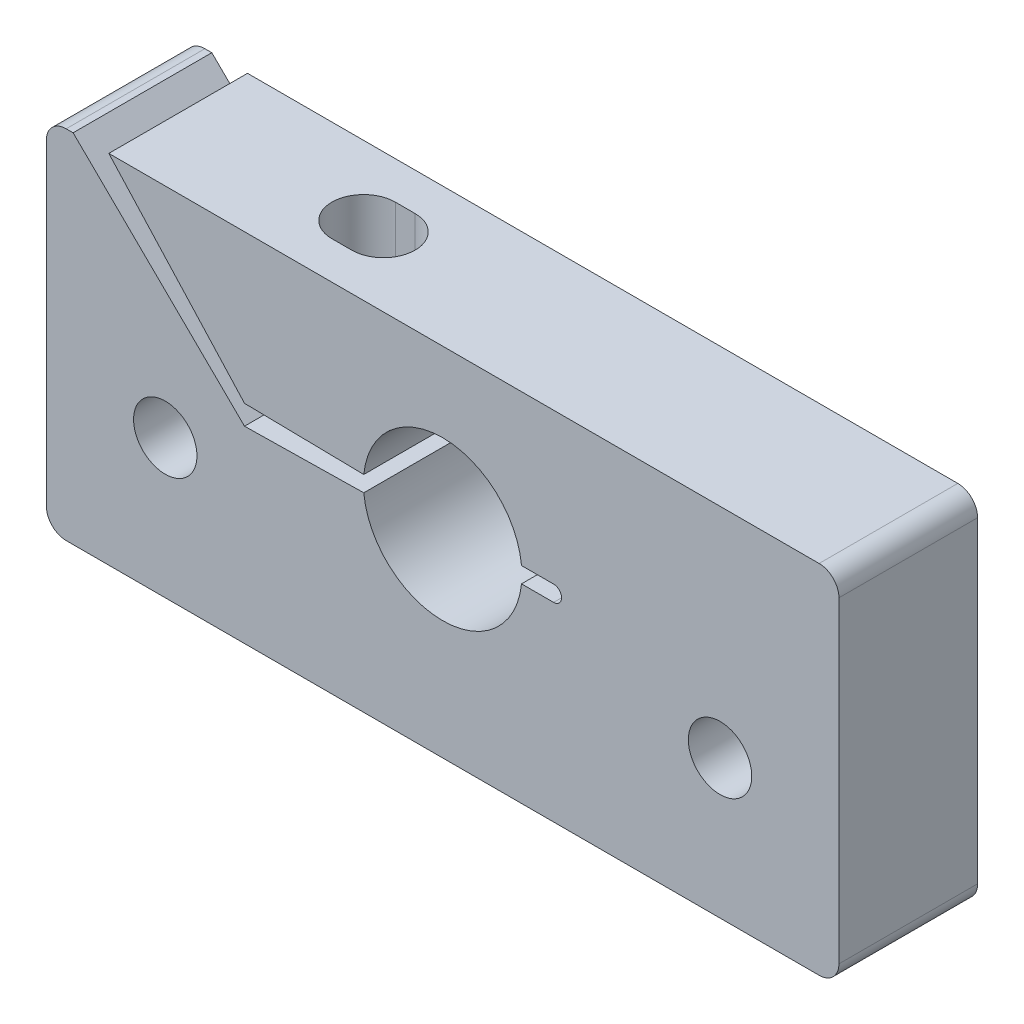
ISO-10303-21;
HEADER;
FILE_DESCRIPTION(('STEP AP214'),'2;1');
FILE_NAME('part.step','',(''),(''),'','','');
FILE_SCHEMA(('AUTOMOTIVE_DESIGN { 1 0 10303 214 1 1 1 1 }'));
ENDSEC;
DATA;
#1=APPLICATION_CONTEXT('core data for automotive mechanical design processes');
#2=APPLICATION_PROTOCOL_DEFINITION('international standard','automotive_design',2000,#1);
#3=PRODUCT_CONTEXT('',#1,'mechanical');
#4=PRODUCT('Part','Part','',(#3));
#5=PRODUCT_RELATED_PRODUCT_CATEGORY('part','',(#4));
#6=PRODUCT_DEFINITION_FORMATION('','',#4);
#7=PRODUCT_DEFINITION_CONTEXT('part definition',#1,'design');
#8=PRODUCT_DEFINITION('design','',#6,#7);
#9=PRODUCT_DEFINITION_SHAPE('','',#8);
#10=(LENGTH_UNIT() NAMED_UNIT(*) SI_UNIT(.MILLI.,.METRE.));
#11=(NAMED_UNIT(*) PLANE_ANGLE_UNIT() SI_UNIT($,.RADIAN.));
#12=(NAMED_UNIT(*) SI_UNIT($,.STERADIAN.) SOLID_ANGLE_UNIT());
#13=UNCERTAINTY_MEASURE_WITH_UNIT(LENGTH_MEASURE(1.E-05),#10,'distance_accuracy_value','');
#14=(GEOMETRIC_REPRESENTATION_CONTEXT(3) GLOBAL_UNCERTAINTY_ASSIGNED_CONTEXT((#13)) GLOBAL_UNIT_ASSIGNED_CONTEXT((#10,
#11,#12)) REPRESENTATION_CONTEXT('',''));
#15=CARTESIAN_POINT('',(0.,0.,0.));
#16=DIRECTION('',(0.,0.,1.));
#17=DIRECTION('',(1.,0.,0.));
#18=AXIS2_PLACEMENT_3D('',#15,#16,#17);
#19=CARTESIAN_POINT('',(5.6,0.,-3.5));
#20=DIRECTION('',(0.,0.,1.));
#21=DIRECTION('',(1.,0.,0.));
#22=AXIS2_PLACEMENT_3D('',#19,#20,#21);
#23=CYLINDRICAL_SURFACE('',#22,0.4);
#24=DIRECTION('',(0.,0.,-1.));
#25=VECTOR('',#24,1.);
#26=CARTESIAN_POINT('',(5.6,0.4,-3.5));
#27=LINE('',#26,#25);
#28=CARTESIAN_POINT('',(5.6,0.4,-3.5));
#29=VERTEX_POINT('',#28);
#30=CARTESIAN_POINT('',(5.6,0.4,3.5));
#31=VERTEX_POINT('',#30);
#32=EDGE_CURVE('E460',#29,#31,#27,.F.);
#33=ORIENTED_EDGE('',*,*,#32,.F.);
#34=CARTESIAN_POINT('',(5.6,0.,-3.5));
#35=DIRECTION('',(0.,0.,1.));
#36=DIRECTION('',(1.,0.,0.));
#37=AXIS2_PLACEMENT_3D('',#34,#35,#36);
#38=CIRCLE('',#37,0.4);
#39=CARTESIAN_POINT('',(5.6,-0.4,-3.5));
#40=VERTEX_POINT('',#39);
#41=EDGE_CURVE('E59',#29,#40,#38,.F.);
#42=ORIENTED_EDGE('',*,*,#41,.T.);
#43=DIRECTION('',(0.,0.,-1.));
#44=VECTOR('',#43,1.);
#45=CARTESIAN_POINT('',(5.6,-0.4,-3.5));
#46=LINE('',#45,#44);
#47=CARTESIAN_POINT('',(5.6,-0.4,3.5));
#48=VERTEX_POINT('',#47);
#49=EDGE_CURVE('E461',#48,#40,#46,.T.);
#50=ORIENTED_EDGE('',*,*,#49,.F.);
#51=CARTESIAN_POINT('',(5.6,0.,3.5));
#52=DIRECTION('',(0.,0.,1.));
#53=DIRECTION('',(1.,0.,0.));
#54=AXIS2_PLACEMENT_3D('',#51,#52,#53);
#55=CIRCLE('',#54,0.4);
#56=EDGE_CURVE('E11',#48,#31,#55,.T.);
#57=ORIENTED_EDGE('',*,*,#56,.T.);
#58=EDGE_LOOP('',(#33,#42,#50,#57));
#59=FACE_BOUND('',#58,.T.);
#60=ADVANCED_FACE('F47',(#59),#23,.F.);
#61=CARTESIAN_POINT('',(-6.98997487421324,8.001,0.));
#62=DIRECTION('',(0.,-1.,0.));
#63=DIRECTION('',(0.,0.,-1.));
#64=AXIS2_PLACEMENT_3D('',#61,#62,#63);
#65=CYLINDRICAL_SURFACE('',#64,1.6);
#66=CARTESIAN_POINT('',(-6.98997487421324,-0.450000000000001,0.));
#67=DIRECTION('',(-0.0166088657318921,0.99986206327628,0.));
#68=DIRECTION('',(-0.99986206327628,-0.0166088657318921,0.));
#69=AXIS2_PLACEMENT_3D('',#66,#67,#68);
#70=ELLIPSE('',#69,1.60022072920462,1.6);
#71=CARTESIAN_POINT('',(-8.58997487421324,-0.476577851232751,0.));
#72=VERTEX_POINT('',#71);
#73=EDGE_CURVE('E260',#72,#72,#70,.F.);
#74=ORIENTED_EDGE('',*,*,#73,.F.);
#75=EDGE_LOOP('',(#74));
#76=FACE_BOUND('',#75,.T.);
#77=CARTESIAN_POINT('',(-6.98997487421324,-4.,0.));
#78=DIRECTION('',(0.,-1.,0.));
#79=DIRECTION('',(0.,0.,-1.));
#80=AXIS2_PLACEMENT_3D('',#77,#78,#79);
#81=CIRCLE('',#80,1.6);
#82=CARTESIAN_POINT('',(-6.98997487421324,-4.,-1.6));
#83=VERTEX_POINT('',#82);
#84=EDGE_CURVE('E216',#83,#83,#81,.T.);
#85=ORIENTED_EDGE('',*,*,#84,.T.);
#86=EDGE_LOOP('',(#85));
#87=FACE_BOUND('',#86,.T.);
#88=ADVANCED_FACE('F488',(#76,#87),#65,.F.);
#89=CARTESIAN_POINT('',(0.,0.,-3.5));
#90=DIRECTION('',(0.,0.,1.));
#91=DIRECTION('',(1.,0.,0.));
#92=AXIS2_PLACEMENT_3D('',#89,#90,#91);
#93=CYLINDRICAL_SURFACE('',#92,4.);
#94=DIRECTION('',(0.,0.,1.));
#95=VECTOR('',#94,1.);
#96=CARTESIAN_POINT('',(3.97994974842648,0.4,-3.5));
#97=LINE('',#96,#95);
#98=CARTESIAN_POINT('',(3.97994974842648,0.4,-3.5));
#99=VERTEX_POINT('',#98);
#100=CARTESIAN_POINT('',(3.97994974842648,0.4,3.5));
#101=VERTEX_POINT('',#100);
#102=EDGE_CURVE('E378',#99,#101,#97,.T.);
#103=ORIENTED_EDGE('',*,*,#102,.T.);
#104=CARTESIAN_POINT('',(0.,0.,3.5));
#105=DIRECTION('',(0.,0.,-1.));
#106=DIRECTION('',(1.,0.,0.));
#107=AXIS2_PLACEMENT_3D('',#104,#105,#106);
#108=CIRCLE('',#107,4.);
#109=CARTESIAN_POINT('',(-3.97994974842648,0.4,3.5));
#110=VERTEX_POINT('',#109);
#111=EDGE_CURVE('E275',#110,#101,#108,.T.);
#112=ORIENTED_EDGE('',*,*,#111,.F.);
#113=DIRECTION('',(0.,0.,1.));
#114=VECTOR('',#113,1.);
#115=CARTESIAN_POINT('',(-3.97994974842648,0.4,-3.5));
#116=LINE('',#115,#114);
#117=CARTESIAN_POINT('',(-3.97994974842648,0.4,-3.5));
#118=VERTEX_POINT('',#117);
#119=EDGE_CURVE('E379',#118,#110,#116,.T.);
#120=ORIENTED_EDGE('',*,*,#119,.F.);
#121=CARTESIAN_POINT('',(0.,0.,-3.5));
#122=DIRECTION('',(0.,0.,-1.));
#123=DIRECTION('',(1.,0.,0.));
#124=AXIS2_PLACEMENT_3D('',#121,#122,#123);
#125=CIRCLE('',#124,4.);
#126=EDGE_CURVE('E326',#118,#99,#125,.T.);
#127=ORIENTED_EDGE('',*,*,#126,.T.);
#128=EDGE_LOOP('',(#103,#112,#120,#127));
#129=FACE_BOUND('',#128,.T.);
#130=ADVANCED_FACE('F495',(#129),#93,.F.);
#131=CARTESIAN_POINT('',(-10.,0.5,-3.5));
#132=DIRECTION('',(-0.0166088657318921,-0.99986206327628,0.));
#133=DIRECTION('',(0.99986206327628,-0.0166088657318921,0.));
#134=AXIS2_PLACEMENT_3D('',#131,#132,#133);
#135=PLANE('',#134);
#136=CARTESIAN_POINT('',(-7.48997487421324,0.458305578510235,0.));
#137=DIRECTION('',(-0.0166088657318921,-0.99986206327628,0.));
#138=DIRECTION('',(-0.99986206327628,0.0166088657318921,0.));
#139=AXIS2_PLACEMENT_3D('',#136,#137,#138);
#140=ELLIPSE('',#139,1.60022072920462,1.6);
#141=CARTESIAN_POINT('',(-7.48997487421324,0.458305578510236,-1.6));
#142=VERTEX_POINT('',#141);
#143=CARTESIAN_POINT('',(-7.48997487421324,0.458305578510236,1.6));
#144=VERTEX_POINT('',#143);
#145=EDGE_CURVE('E204',#142,#144,#140,.F.);
#146=ORIENTED_EDGE('',*,*,#145,.T.);
#147=DIRECTION('',(0.99986206327628,-0.0166088657318921,0.));
#148=VECTOR('',#147,1.);
#149=CARTESIAN_POINT('',(-7.31628163419263,0.45542033282686,1.6));
#150=LINE('',#149,#148);
#151=CARTESIAN_POINT('',(-6.48997487421324,0.441694421489766,1.6));
#152=VERTEX_POINT('',#151);
#153=EDGE_CURVE('E231',#144,#152,#150,.T.);
#154=ORIENTED_EDGE('',*,*,#153,.T.);
#155=CARTESIAN_POINT('',(-6.48997487421324,0.441694421489766,0.));
#156=DIRECTION('',(-0.0166088657318921,-0.99986206327628,0.));
#157=DIRECTION('',(-0.99986206327628,0.0166088657318921,0.));
#158=AXIS2_PLACEMENT_3D('',#155,#156,#157);
#159=ELLIPSE('',#158,1.60022072920462,1.6);
#160=CARTESIAN_POINT('',(-6.48997487421324,0.441694421489766,-1.6));
#161=VERTEX_POINT('',#160);
#162=EDGE_CURVE('E210',#152,#161,#159,.F.);
#163=ORIENTED_EDGE('',*,*,#162,.T.);
#164=DIRECTION('',(-0.99986206327628,0.0166088657318921,0.));
#165=VECTOR('',#164,1.);
#166=CARTESIAN_POINT('',(-7.31628163419263,0.45542033282686,-1.6));
#167=LINE('',#166,#165);
#168=EDGE_CURVE('E206',#161,#142,#167,.T.);
#169=ORIENTED_EDGE('',*,*,#168,.T.);
#170=EDGE_LOOP('',(#146,#154,#163,#169));
#171=FACE_BOUND('',#170,.T.);
#172=ORIENTED_EDGE('',*,*,#119,.T.);
#173=DIRECTION('',(0.99986206327628,-0.0166088657318921,0.));
#174=VECTOR('',#173,1.);
#175=CARTESIAN_POINT('',(-10.,0.5,3.5));
#176=LINE('',#175,#174);
#177=CARTESIAN_POINT('',(-10.,0.5,3.5));
#178=VERTEX_POINT('',#177);
#179=EDGE_CURVE('E320',#178,#110,#176,.T.);
#180=ORIENTED_EDGE('',*,*,#179,.F.);
#181=DIRECTION('',(0.,0.,1.));
#182=VECTOR('',#181,1.);
#183=CARTESIAN_POINT('',(-10.,0.5,-3.5));
#184=LINE('',#183,#182);
#185=CARTESIAN_POINT('',(-10.,0.5,-3.5));
#186=VERTEX_POINT('',#185);
#187=EDGE_CURVE('E381',#186,#178,#184,.T.);
#188=ORIENTED_EDGE('',*,*,#187,.F.);
#189=DIRECTION('',(0.99986206327628,-0.0166088657318921,0.));
#190=VECTOR('',#189,1.);
#191=CARTESIAN_POINT('',(-10.,0.5,-3.5));
#192=LINE('',#191,#190);
#193=EDGE_CURVE('E374',#186,#118,#192,.T.);
#194=ORIENTED_EDGE('',*,*,#193,.T.);
#195=EDGE_LOOP('',(#172,#180,#188,#194));
#196=FACE_BOUND('',#195,.T.);
#197=ADVANCED_FACE('F468',(#171,#196),#135,.T.);
#198=CARTESIAN_POINT('',(-10.,0.5,-3.5));
#199=DIRECTION('',(-0.73845534062588,-0.674302387583728,0.));
#200=DIRECTION('',(0.674302387583728,-0.73845534062588,0.));
#201=AXIS2_PLACEMENT_3D('',#198,#199,#200);
#202=PLANE('',#201);
#203=ORIENTED_EDGE('',*,*,#187,.T.);
#204=DIRECTION('',(0.674302387583728,-0.73845534062588,0.));
#205=VECTOR('',#204,1.);
#206=CARTESIAN_POINT('',(-10.,0.5,3.5));
#207=LINE('',#206,#205);
#208=CARTESIAN_POINT('',(-16.8484411021954,8.,3.5));
#209=VERTEX_POINT('',#208);
#210=EDGE_CURVE('E312',#209,#178,#207,.T.);
#211=ORIENTED_EDGE('',*,*,#210,.F.);
#212=DIRECTION('',(0.,0.,1.));
#213=VECTOR('',#212,1.);
#214=CARTESIAN_POINT('',(-16.8484411021954,8.,-3.5));
#215=LINE('',#214,#213);
#216=CARTESIAN_POINT('',(-16.8484411021954,8.,-3.5));
#217=VERTEX_POINT('',#216);
#218=EDGE_CURVE('E390',#217,#209,#215,.T.);
#219=ORIENTED_EDGE('',*,*,#218,.F.);
#220=DIRECTION('',(0.674302387583728,-0.73845534062588,0.));
#221=VECTOR('',#220,1.);
#222=CARTESIAN_POINT('',(-10.,0.5,-3.5));
#223=LINE('',#222,#221);
#224=EDGE_CURVE('E371',#217,#186,#223,.T.);
#225=ORIENTED_EDGE('',*,*,#224,.T.);
#226=EDGE_LOOP('',(#203,#211,#219,#225));
#227=FACE_BOUND('',#226,.T.);
#228=ADVANCED_FACE('F511',(#227),#202,.T.);
#229=CARTESIAN_POINT('',(-16.8484411021954,8.,-3.5));
#230=DIRECTION('',(0.,1.,0.));
#231=DIRECTION('',(-1.,0.,0.));
#232=AXIS2_PLACEMENT_3D('',#229,#230,#231);
#233=PLANE('',#232);
#234=CARTESIAN_POINT('',(-7.48997487421324,8.,0.));
#235=DIRECTION('',(0.,1.,0.));
#236=DIRECTION('',(0.,0.,1.));
#237=AXIS2_PLACEMENT_3D('',#234,#235,#236);
#238=CIRCLE('',#237,1.6);
#239=CARTESIAN_POINT('',(-7.48997487421324,8.,-1.6));
#240=VERTEX_POINT('',#239);
#241=CARTESIAN_POINT('',(-7.48997487421324,8.,1.6));
#242=VERTEX_POINT('',#241);
#243=EDGE_CURVE('E198',#240,#242,#238,.T.);
#244=ORIENTED_EDGE('',*,*,#243,.F.);
#245=DIRECTION('',(-1.,0.,0.));
#246=VECTOR('',#245,1.);
#247=CARTESIAN_POINT('',(-7.48997487421324,8.,-1.6));
#248=LINE('',#247,#246);
#249=CARTESIAN_POINT('',(-6.48997487421324,8.,-1.6));
#250=VERTEX_POINT('',#249);
#251=EDGE_CURVE('E211',#250,#240,#248,.T.);
#252=ORIENTED_EDGE('',*,*,#251,.F.);
#253=CARTESIAN_POINT('',(-6.48997487421324,8.,0.));
#254=DIRECTION('',(0.,1.,0.));
#255=DIRECTION('',(0.,0.,1.));
#256=AXIS2_PLACEMENT_3D('',#253,#254,#255);
#257=CIRCLE('',#256,1.6);
#258=CARTESIAN_POINT('',(-6.48997487421324,8.,1.6));
#259=VERTEX_POINT('',#258);
#260=EDGE_CURVE('E218',#259,#250,#257,.T.);
#261=ORIENTED_EDGE('',*,*,#260,.F.);
#262=DIRECTION('',(1.,0.,0.));
#263=VECTOR('',#262,1.);
#264=CARTESIAN_POINT('',(-7.48997487421324,8.,1.6));
#265=LINE('',#264,#263);
#266=EDGE_CURVE('E228',#242,#259,#265,.T.);
#267=ORIENTED_EDGE('',*,*,#266,.F.);
#268=EDGE_LOOP('',(#244,#252,#261,#267));
#269=FACE_BOUND('',#268,.T.);
#270=DIRECTION('',(-1.,0.,0.));
#271=VECTOR('',#270,1.);
#272=CARTESIAN_POINT('',(-16.8484411021954,8.,3.5));
#273=LINE('',#272,#271);
#274=CARTESIAN_POINT('',(19.,8.,3.5));
#275=VERTEX_POINT('',#274);
#276=EDGE_CURVE('E309',#275,#209,#273,.T.);
#277=ORIENTED_EDGE('',*,*,#276,.F.);
#278=DIRECTION('',(0.,0.,1.));
#279=VECTOR('',#278,1.);
#280=CARTESIAN_POINT('',(19.,8.,-3.5));
#281=LINE('',#280,#279);
#282=CARTESIAN_POINT('',(19.,8.,-3.5));
#283=VERTEX_POINT('',#282);
#284=EDGE_CURVE('E448',#275,#283,#281,.F.);
#285=ORIENTED_EDGE('',*,*,#284,.T.);
#286=DIRECTION('',(-1.,0.,0.));
#287=VECTOR('',#286,1.);
#288=CARTESIAN_POINT('',(-16.8484411021954,8.,-3.5));
#289=LINE('',#288,#287);
#290=EDGE_CURVE('E368',#283,#217,#289,.T.);
#291=ORIENTED_EDGE('',*,*,#290,.T.);
#292=ORIENTED_EDGE('',*,*,#218,.T.);
#293=EDGE_LOOP('',(#277,#285,#291,#292));
#294=FACE_BOUND('',#293,.T.);
#295=ADVANCED_FACE('F224',(#269,#294),#233,.T.);
#296=CARTESIAN_POINT('',(20.,8.,-3.5));
#297=DIRECTION('',(1.,0.,0.));
#298=DIRECTION('',(0.,1.,0.));
#299=AXIS2_PLACEMENT_3D('',#296,#297,#298);
#300=PLANE('',#299);
#301=DIRECTION('',(0.,1.,0.));
#302=VECTOR('',#301,1.);
#303=CARTESIAN_POINT('',(20.,8.,3.5));
#304=LINE('',#303,#302);
#305=CARTESIAN_POINT('',(20.,-9.,3.5));
#306=VERTEX_POINT('',#305);
#307=CARTESIAN_POINT('',(20.,7.,3.5));
#308=VERTEX_POINT('',#307);
#309=EDGE_CURVE('E306',#306,#308,#304,.T.);
#310=ORIENTED_EDGE('',*,*,#309,.F.);
#311=DIRECTION('',(0.,0.,1.));
#312=VECTOR('',#311,1.);
#313=CARTESIAN_POINT('',(20.,-9.,-3.5));
#314=LINE('',#313,#312);
#315=CARTESIAN_POINT('',(20.,-9.,-3.5));
#316=VERTEX_POINT('',#315);
#317=EDGE_CURVE('E450',#306,#316,#314,.F.);
#318=ORIENTED_EDGE('',*,*,#317,.T.);
#319=DIRECTION('',(0.,1.,0.));
#320=VECTOR('',#319,1.);
#321=CARTESIAN_POINT('',(20.,8.,-3.5));
#322=LINE('',#321,#320);
#323=CARTESIAN_POINT('',(20.,7.,-3.5));
#324=VERTEX_POINT('',#323);
#325=EDGE_CURVE('E364',#316,#324,#322,.T.);
#326=ORIENTED_EDGE('',*,*,#325,.T.);
#327=DIRECTION('',(0.,0.,1.));
#328=VECTOR('',#327,1.);
#329=CARTESIAN_POINT('',(20.,7.,-3.5));
#330=LINE('',#329,#328);
#331=EDGE_CURVE('E442',#324,#308,#330,.T.);
#332=ORIENTED_EDGE('',*,*,#331,.T.);
#333=EDGE_LOOP('',(#310,#318,#326,#332));
#334=FACE_BOUND('',#333,.T.);
#335=ADVANCED_FACE('F523',(#334),#300,.T.);
#336=CARTESIAN_POINT('',(-20.,-10.,-3.5));
#337=DIRECTION('',(0.,-1.,0.));
#338=DIRECTION('',(0.,0.,-1.));
#339=AXIS2_PLACEMENT_3D('',#336,#337,#338);
#340=PLANE('',#339);
#341=CARTESIAN_POINT('',(-6.98997487421324,-10.,0.));
#342=DIRECTION('',(0.,-1.,0.));
#343=DIRECTION('',(0.,0.,-1.));
#344=AXIS2_PLACEMENT_3D('',#341,#342,#343);
#345=CIRCLE('',#344,2.2);
#346=CARTESIAN_POINT('',(-6.98997487421324,-10.,-2.2));
#347=VERTEX_POINT('',#346);
#348=EDGE_CURVE('E255',#347,#347,#345,.T.);
#349=ORIENTED_EDGE('',*,*,#348,.F.);
#350=EDGE_LOOP('',(#349));
#351=FACE_BOUND('',#350,.T.);
#352=DIRECTION('',(1.,0.,0.));
#353=VECTOR('',#352,1.);
#354=CARTESIAN_POINT('',(-20.,-10.,3.5));
#355=LINE('',#354,#353);
#356=CARTESIAN_POINT('',(-19.,-10.,3.5));
#357=VERTEX_POINT('',#356);
#358=CARTESIAN_POINT('',(19.,-10.,3.5));
#359=VERTEX_POINT('',#358);
#360=EDGE_CURVE('E305',#357,#359,#355,.T.);
#361=ORIENTED_EDGE('',*,*,#360,.F.);
#362=DIRECTION('',(0.,0.,1.));
#363=VECTOR('',#362,1.);
#364=CARTESIAN_POINT('',(-19.,-10.,-3.5));
#365=LINE('',#364,#363);
#366=CARTESIAN_POINT('',(-19.,-10.,-3.5));
#367=VERTEX_POINT('',#366);
#368=EDGE_CURVE('E426',#357,#367,#365,.F.);
#369=ORIENTED_EDGE('',*,*,#368,.T.);
#370=DIRECTION('',(1.,0.,0.));
#371=VECTOR('',#370,1.);
#372=CARTESIAN_POINT('',(-20.,-10.,-3.5));
#373=LINE('',#372,#371);
#374=CARTESIAN_POINT('',(19.,-10.,-3.5));
#375=VERTEX_POINT('',#374);
#376=EDGE_CURVE('E359',#367,#375,#373,.T.);
#377=ORIENTED_EDGE('',*,*,#376,.T.);
#378=DIRECTION('',(0.,0.,1.));
#379=VECTOR('',#378,1.);
#380=CARTESIAN_POINT('',(19.,-10.,-3.5));
#381=LINE('',#380,#379);
#382=EDGE_CURVE('E425',#375,#359,#381,.T.);
#383=ORIENTED_EDGE('',*,*,#382,.T.);
#384=EDGE_LOOP('',(#361,#369,#377,#383));
#385=FACE_BOUND('',#384,.T.);
#386=ADVANCED_FACE('F531',(#351,#385),#340,.T.);
#387=CARTESIAN_POINT('',(-20.,8.,-3.5));
#388=DIRECTION('',(-1.,0.,0.));
#389=DIRECTION('',(0.,-1.,0.));
#390=AXIS2_PLACEMENT_3D('',#387,#388,#389);
#391=PLANE('',#390);
#392=DIRECTION('',(0.,-1.,0.));
#393=VECTOR('',#392,1.);
#394=CARTESIAN_POINT('',(-20.,8.,-3.5));
#395=LINE('',#394,#393);
#396=CARTESIAN_POINT('',(-20.,7.,-3.5));
#397=VERTEX_POINT('',#396);
#398=CARTESIAN_POINT('',(-20.,-9.,-3.5));
#399=VERTEX_POINT('',#398);
#400=EDGE_CURVE('E358',#397,#399,#395,.T.);
#401=ORIENTED_EDGE('',*,*,#400,.T.);
#402=DIRECTION('',(0.,0.,1.));
#403=VECTOR('',#402,1.);
#404=CARTESIAN_POINT('',(-20.,-9.,-3.5));
#405=LINE('',#404,#403);
#406=CARTESIAN_POINT('',(-20.,-9.,3.5));
#407=VERTEX_POINT('',#406);
#408=EDGE_CURVE('E407',#399,#407,#405,.T.);
#409=ORIENTED_EDGE('',*,*,#408,.T.);
#410=DIRECTION('',(0.,-1.,0.));
#411=VECTOR('',#410,1.);
#412=CARTESIAN_POINT('',(-20.,8.,3.5));
#413=LINE('',#412,#411);
#414=CARTESIAN_POINT('',(-20.,7.,3.5));
#415=VERTEX_POINT('',#414);
#416=EDGE_CURVE('E296',#415,#407,#413,.T.);
#417=ORIENTED_EDGE('',*,*,#416,.F.);
#418=DIRECTION('',(0.,0.,1.));
#419=VECTOR('',#418,1.);
#420=CARTESIAN_POINT('',(-20.,7.,-3.5));
#421=LINE('',#420,#419);
#422=EDGE_CURVE('E384',#415,#397,#421,.F.);
#423=ORIENTED_EDGE('',*,*,#422,.T.);
#424=EDGE_LOOP('',(#401,#409,#417,#423));
#425=FACE_BOUND('',#424,.T.);
#426=ADVANCED_FACE('F542',(#425),#391,.T.);
#427=CARTESIAN_POINT('',(-20.,8.,-3.5));
#428=DIRECTION('',(0.,1.,0.));
#429=DIRECTION('',(0.,0.,1.));
#430=AXIS2_PLACEMENT_3D('',#427,#428,#429);
#431=PLANE('',#430);
#432=DIRECTION('',(-1.,0.,0.));
#433=VECTOR('',#432,1.);
#434=CARTESIAN_POINT('',(-20.,8.,-3.5));
#435=LINE('',#434,#433);
#436=CARTESIAN_POINT('',(-18.6496628402632,8.,-3.5));
#437=VERTEX_POINT('',#436);
#438=CARTESIAN_POINT('',(-19.,8.,-3.5));
#439=VERTEX_POINT('',#438);
#440=EDGE_CURVE('E352',#437,#439,#435,.T.);
#441=ORIENTED_EDGE('',*,*,#440,.T.);
#442=DIRECTION('',(0.,0.,1.));
#443=VECTOR('',#442,1.);
#444=CARTESIAN_POINT('',(-19.,8.,-3.5));
#445=LINE('',#444,#443);
#446=CARTESIAN_POINT('',(-19.,8.,3.5));
#447=VERTEX_POINT('',#446);
#448=EDGE_CURVE('E452',#439,#447,#445,.T.);
#449=ORIENTED_EDGE('',*,*,#448,.T.);
#450=DIRECTION('',(-1.,0.,0.));
#451=VECTOR('',#450,1.);
#452=CARTESIAN_POINT('',(-20.,8.,3.5));
#453=LINE('',#452,#451);
#454=CARTESIAN_POINT('',(-18.6496628402632,8.,3.5));
#455=VERTEX_POINT('',#454);
#456=EDGE_CURVE('E295',#455,#447,#453,.T.);
#457=ORIENTED_EDGE('',*,*,#456,.F.);
#458=DIRECTION('',(0.,0.,1.));
#459=VECTOR('',#458,1.);
#460=CARTESIAN_POINT('',(-18.6496628402632,8.,-3.5));
#461=LINE('',#460,#459);
#462=EDGE_CURVE('E392',#437,#455,#461,.T.);
#463=ORIENTED_EDGE('',*,*,#462,.F.);
#464=EDGE_LOOP('',(#441,#449,#457,#463));
#465=FACE_BOUND('',#464,.T.);
#466=ADVANCED_FACE('F548',(#465),#431,.T.);
#467=CARTESIAN_POINT('',(-10.,-0.5,-3.5));
#468=DIRECTION('',(0.700909264299847,0.713250449154186,0.));
#469=DIRECTION('',(-0.713250449154186,0.700909264299847,0.));
#470=AXIS2_PLACEMENT_3D('',#467,#468,#469);
#471=PLANE('',#470);
#472=ORIENTED_EDGE('',*,*,#462,.T.);
#473=DIRECTION('',(-0.713250449154186,0.700909264299847,0.));
#474=VECTOR('',#473,1.);
#475=CARTESIAN_POINT('',(-10.,-0.5,3.5));
#476=LINE('',#475,#474);
#477=CARTESIAN_POINT('',(-10.,-0.5,3.5));
#478=VERTEX_POINT('',#477);
#479=EDGE_CURVE('E290',#478,#455,#476,.T.);
#480=ORIENTED_EDGE('',*,*,#479,.F.);
#481=DIRECTION('',(0.,0.,1.));
#482=VECTOR('',#481,1.);
#483=CARTESIAN_POINT('',(-10.,-0.5,-3.5));
#484=LINE('',#483,#482);
#485=CARTESIAN_POINT('',(-10.,-0.5,-3.5));
#486=VERTEX_POINT('',#485);
#487=EDGE_CURVE('E391',#486,#478,#484,.T.);
#488=ORIENTED_EDGE('',*,*,#487,.F.);
#489=DIRECTION('',(-0.713250449154186,0.700909264299847,0.));
#490=VECTOR('',#489,1.);
#491=CARTESIAN_POINT('',(-10.,-0.5,-3.5));
#492=LINE('',#491,#490);
#493=EDGE_CURVE('E349',#486,#437,#492,.T.);
#494=ORIENTED_EDGE('',*,*,#493,.T.);
#495=EDGE_LOOP('',(#472,#480,#488,#494));
#496=FACE_BOUND('',#495,.T.);
#497=ADVANCED_FACE('F555',(#496),#471,.T.);
#498=CARTESIAN_POINT('',(-10.,-0.5,-3.5));
#499=DIRECTION('',(-0.0166088657318921,0.99986206327628,0.));
#500=DIRECTION('',(-0.99986206327628,-0.0166088657318921,0.));
#501=AXIS2_PLACEMENT_3D('',#498,#499,#500);
#502=PLANE('',#501);
#503=ORIENTED_EDGE('',*,*,#73,.T.);
#504=EDGE_LOOP('',(#503));
#505=FACE_BOUND('',#504,.T.);
#506=ORIENTED_EDGE('',*,*,#487,.T.);
#507=DIRECTION('',(-0.99986206327628,-0.0166088657318921,0.));
#508=VECTOR('',#507,1.);
#509=CARTESIAN_POINT('',(-10.,-0.5,3.5));
#510=LINE('',#509,#508);
#511=CARTESIAN_POINT('',(-3.97994974842648,-0.399999999999999,3.5));
#512=VERTEX_POINT('',#511);
#513=EDGE_CURVE('E286',#512,#478,#510,.T.);
#514=ORIENTED_EDGE('',*,*,#513,.F.);
#515=DIRECTION('',(0.,0.,1.));
#516=VECTOR('',#515,1.);
#517=CARTESIAN_POINT('',(-3.97994974842648,-0.399999999999999,-3.5));
#518=LINE('',#517,#516);
#519=CARTESIAN_POINT('',(-3.97994974842648,-0.399999999999999,-3.5));
#520=VERTEX_POINT('',#519);
#521=EDGE_CURVE('E397',#520,#512,#518,.T.);
#522=ORIENTED_EDGE('',*,*,#521,.F.);
#523=DIRECTION('',(-0.99986206327628,-0.0166088657318921,0.));
#524=VECTOR('',#523,1.);
#525=CARTESIAN_POINT('',(-10.,-0.5,-3.5));
#526=LINE('',#525,#524);
#527=EDGE_CURVE('E343',#520,#486,#526,.T.);
#528=ORIENTED_EDGE('',*,*,#527,.T.);
#529=EDGE_LOOP('',(#506,#514,#522,#528));
#530=FACE_BOUND('',#529,.T.);
#531=ADVANCED_FACE('F556',(#505,#530),#502,.T.);
#532=CARTESIAN_POINT('',(0.,0.,-3.5));
#533=DIRECTION('',(0.,0.,1.));
#534=DIRECTION('',(1.,0.,0.));
#535=AXIS2_PLACEMENT_3D('',#532,#533,#534);
#536=CYLINDRICAL_SURFACE('',#535,4.);
#537=ORIENTED_EDGE('',*,*,#521,.T.);
#538=CARTESIAN_POINT('',(0.,0.,3.5));
#539=DIRECTION('',(0.,0.,-1.));
#540=DIRECTION('',(1.,0.,0.));
#541=AXIS2_PLACEMENT_3D('',#538,#539,#540);
#542=CIRCLE('',#541,4.);
#543=CARTESIAN_POINT('',(3.97994974842648,-0.4,3.5));
#544=VERTEX_POINT('',#543);
#545=EDGE_CURVE('E285',#544,#512,#542,.T.);
#546=ORIENTED_EDGE('',*,*,#545,.F.);
#547=DIRECTION('',(0.,0.,1.));
#548=VECTOR('',#547,1.);
#549=CARTESIAN_POINT('',(3.97994974842648,-0.4,-3.5));
#550=LINE('',#549,#548);
#551=CARTESIAN_POINT('',(3.97994974842648,-0.4,-3.5));
#552=VERTEX_POINT('',#551);
#553=EDGE_CURVE('E400',#552,#544,#550,.T.);
#554=ORIENTED_EDGE('',*,*,#553,.F.);
#555=CARTESIAN_POINT('',(0.,0.,-3.5));
#556=DIRECTION('',(0.,0.,-1.));
#557=DIRECTION('',(1.,0.,0.));
#558=AXIS2_PLACEMENT_3D('',#555,#556,#557);
#559=CIRCLE('',#558,4.);
#560=EDGE_CURVE('E338',#552,#520,#559,.T.);
#561=ORIENTED_EDGE('',*,*,#560,.T.);
#562=EDGE_LOOP('',(#537,#546,#554,#561));
#563=FACE_BOUND('',#562,.T.);
#564=ADVANCED_FACE('F563',(#563),#536,.F.);
#565=CARTESIAN_POINT('',(3.97994974842648,-0.4,-3.5));
#566=DIRECTION('',(0.,1.,0.));
#567=DIRECTION('',(0.,0.,1.));
#568=AXIS2_PLACEMENT_3D('',#565,#566,#567);
#569=PLANE('',#568);
#570=DIRECTION('',(-1.,0.,0.));
#571=VECTOR('',#570,1.);
#572=CARTESIAN_POINT('',(3.97994974842648,-0.4,3.5));
#573=LINE('',#572,#571);
#574=EDGE_CURVE('E278',#48,#544,#573,.T.);
#575=ORIENTED_EDGE('',*,*,#574,.F.);
#576=ORIENTED_EDGE('',*,*,#49,.T.);
#577=DIRECTION('',(-1.,0.,0.));
#578=VECTOR('',#577,1.);
#579=CARTESIAN_POINT('',(3.97994974842648,-0.4,-3.5));
#580=LINE('',#579,#578);
#581=EDGE_CURVE('E340',#40,#552,#580,.T.);
#582=ORIENTED_EDGE('',*,*,#581,.T.);
#583=ORIENTED_EDGE('',*,*,#553,.T.);
#584=EDGE_LOOP('',(#575,#576,#582,#583));
#585=FACE_BOUND('',#584,.T.);
#586=ADVANCED_FACE('F566',(#585),#569,.T.);
#587=CARTESIAN_POINT('',(3.97994974842648,0.4,-3.5));
#588=DIRECTION('',(0.,-1.,0.));
#589=DIRECTION('',(0.,0.,-1.));
#590=AXIS2_PLACEMENT_3D('',#587,#588,#589);
#591=PLANE('',#590);
#592=DIRECTION('',(1.,0.,0.));
#593=VECTOR('',#592,1.);
#594=CARTESIAN_POINT('',(3.97994974842648,0.4,-3.5));
#595=LINE('',#594,#593);
#596=EDGE_CURVE('E334',#99,#29,#595,.T.);
#597=ORIENTED_EDGE('',*,*,#596,.T.);
#598=ORIENTED_EDGE('',*,*,#32,.T.);
#599=DIRECTION('',(1.,0.,0.));
#600=VECTOR('',#599,1.);
#601=CARTESIAN_POINT('',(3.97994974842648,0.4,3.5));
#602=LINE('',#601,#600);
#603=EDGE_CURVE('E276',#101,#31,#602,.T.);
#604=ORIENTED_EDGE('',*,*,#603,.F.);
#605=ORIENTED_EDGE('',*,*,#102,.F.);
#606=EDGE_LOOP('',(#597,#598,#604,#605));
#607=FACE_BOUND('',#606,.T.);
#608=ADVANCED_FACE('F498',(#607),#591,.T.);
#609=CARTESIAN_POINT('',(0.,0.,-3.5));
#610=DIRECTION('',(0.,0.,1.));
#611=DIRECTION('',(1.,0.,0.));
#612=AXIS2_PLACEMENT_3D('',#609,#610,#611);
#613=PLANE('',#612);
#614=CARTESIAN_POINT('',(14.,-3.,-3.5));
#615=DIRECTION('',(0.,0.,1.));
#616=DIRECTION('',(-1.,0.,0.));
#617=AXIS2_PLACEMENT_3D('',#614,#615,#616);
#618=CIRCLE('',#617,1.6);
#619=CARTESIAN_POINT('',(12.4,-3.,-3.5));
#620=VERTEX_POINT('',#619);
#621=EDGE_CURVE('E321',#620,#620,#618,.T.);
#622=ORIENTED_EDGE('',*,*,#621,.T.);
#623=EDGE_LOOP('',(#622));
#624=FACE_BOUND('',#623,.T.);
#625=CARTESIAN_POINT('',(-14.,-3.,-3.5));
#626=DIRECTION('',(0.,0.,1.));
#627=DIRECTION('',(1.,0.,0.));
#628=AXIS2_PLACEMENT_3D('',#625,#626,#627);
#629=CIRCLE('',#628,1.6);
#630=CARTESIAN_POINT('',(-12.4,-3.,-3.5));
#631=VERTEX_POINT('',#630);
#632=EDGE_CURVE('E324',#631,#631,#629,.T.);
#633=ORIENTED_EDGE('',*,*,#632,.T.);
#634=EDGE_LOOP('',(#633));
#635=FACE_BOUND('',#634,.T.);
#636=ORIENTED_EDGE('',*,*,#376,.F.);
#637=CARTESIAN_POINT('',(-19.,-9.,-3.5));
#638=DIRECTION('',(0.,0.,1.));
#639=DIRECTION('',(1.,0.,0.));
#640=AXIS2_PLACEMENT_3D('',#637,#638,#639);
#641=CIRCLE('',#640,1.);
#642=EDGE_CURVE('E439',#367,#399,#641,.F.);
#643=ORIENTED_EDGE('',*,*,#642,.T.);
#644=ORIENTED_EDGE('',*,*,#400,.F.);
#645=CARTESIAN_POINT('',(-19.,7.,-3.5));
#646=DIRECTION('',(0.,0.,1.));
#647=DIRECTION('',(1.,0.,0.));
#648=AXIS2_PLACEMENT_3D('',#645,#646,#647);
#649=CIRCLE('',#648,1.);
#650=EDGE_CURVE('E431',#397,#439,#649,.F.);
#651=ORIENTED_EDGE('',*,*,#650,.T.);
#652=ORIENTED_EDGE('',*,*,#440,.F.);
#653=ORIENTED_EDGE('',*,*,#493,.F.);
#654=ORIENTED_EDGE('',*,*,#527,.F.);
#655=ORIENTED_EDGE('',*,*,#560,.F.);
#656=ORIENTED_EDGE('',*,*,#581,.F.);
#657=ORIENTED_EDGE('',*,*,#41,.F.);
#658=ORIENTED_EDGE('',*,*,#596,.F.);
#659=ORIENTED_EDGE('',*,*,#126,.F.);
#660=ORIENTED_EDGE('',*,*,#193,.F.);
#661=ORIENTED_EDGE('',*,*,#224,.F.);
#662=ORIENTED_EDGE('',*,*,#290,.F.);
#663=CARTESIAN_POINT('',(19.,7.,-3.5));
#664=DIRECTION('',(0.,0.,1.));
#665=DIRECTION('',(1.,0.,0.));
#666=AXIS2_PLACEMENT_3D('',#663,#664,#665);
#667=CIRCLE('',#666,1.);
#668=EDGE_CURVE('E432',#283,#324,#667,.F.);
#669=ORIENTED_EDGE('',*,*,#668,.T.);
#670=ORIENTED_EDGE('',*,*,#325,.F.);
#671=CARTESIAN_POINT('',(19.,-9.,-3.5));
#672=DIRECTION('',(0.,0.,1.));
#673=DIRECTION('',(1.,0.,0.));
#674=AXIS2_PLACEMENT_3D('',#671,#672,#673);
#675=CIRCLE('',#674,1.);
#676=EDGE_CURVE('E440',#316,#375,#675,.F.);
#677=ORIENTED_EDGE('',*,*,#676,.T.);
#678=EDGE_LOOP('',(#636,#643,#644,#651,#652,#653,#654,#655,#656,#657,#658,#659,#660,#661,#662,
#669,#670,#677));
#679=FACE_BOUND('',#678,.T.);
#680=ADVANCED_FACE('F505',(#624,#635,#679),#613,.F.);
#681=CARTESIAN_POINT('',(-14.,-3.,-3.5));
#682=DIRECTION('',(0.,0.,1.));
#683=DIRECTION('',(1.,0.,0.));
#684=AXIS2_PLACEMENT_3D('',#681,#682,#683);
#685=CYLINDRICAL_SURFACE('',#684,1.6);
#686=ORIENTED_EDGE('',*,*,#632,.F.);
#687=EDGE_LOOP('',(#686));
#688=FACE_BOUND('',#687,.T.);
#689=CARTESIAN_POINT('',(-14.,-3.,3.5));
#690=DIRECTION('',(0.,0.,1.));
#691=DIRECTION('',(1.,0.,0.));
#692=AXIS2_PLACEMENT_3D('',#689,#690,#691);
#693=CIRCLE('',#692,1.6);
#694=CARTESIAN_POINT('',(-12.4,-3.,3.5));
#695=VERTEX_POINT('',#694);
#696=EDGE_CURVE('E269',#695,#695,#693,.T.);
#697=ORIENTED_EDGE('',*,*,#696,.T.);
#698=EDGE_LOOP('',(#697));
#699=FACE_BOUND('',#698,.T.);
#700=ADVANCED_FACE('F710',(#688,#699),#685,.F.);
#701=CARTESIAN_POINT('',(14.,-3.,-3.5));
#702=DIRECTION('',(0.,0.,1.));
#703=DIRECTION('',(1.,0.,0.));
#704=AXIS2_PLACEMENT_3D('',#701,#702,#703);
#705=CYLINDRICAL_SURFACE('',#704,1.6);
#706=ORIENTED_EDGE('',*,*,#621,.F.);
#707=EDGE_LOOP('',(#706));
#708=FACE_BOUND('',#707,.T.);
#709=CARTESIAN_POINT('',(14.,-3.,3.5));
#710=DIRECTION('',(0.,0.,1.));
#711=DIRECTION('',(-1.,0.,0.));
#712=AXIS2_PLACEMENT_3D('',#709,#710,#711);
#713=CIRCLE('',#712,1.6);
#714=CARTESIAN_POINT('',(12.4,-3.,3.5));
#715=VERTEX_POINT('',#714);
#716=EDGE_CURVE('E261',#715,#715,#713,.T.);
#717=ORIENTED_EDGE('',*,*,#716,.T.);
#718=EDGE_LOOP('',(#717));
#719=FACE_BOUND('',#718,.T.);
#720=ADVANCED_FACE('F700',(#708,#719),#705,.F.);
#721=CARTESIAN_POINT('',(0.,0.,3.5));
#722=DIRECTION('',(0.,0.,1.));
#723=DIRECTION('',(1.,0.,0.));
#724=AXIS2_PLACEMENT_3D('',#721,#722,#723);
#725=PLANE('',#724);
#726=ORIENTED_EDGE('',*,*,#56,.F.);
#727=ORIENTED_EDGE('',*,*,#574,.T.);
#728=ORIENTED_EDGE('',*,*,#545,.T.);
#729=ORIENTED_EDGE('',*,*,#513,.T.);
#730=ORIENTED_EDGE('',*,*,#479,.T.);
#731=ORIENTED_EDGE('',*,*,#456,.T.);
#732=CARTESIAN_POINT('',(-19.,7.,3.5));
#733=DIRECTION('',(0.,0.,1.));
#734=DIRECTION('',(1.,0.,0.));
#735=AXIS2_PLACEMENT_3D('',#732,#733,#734);
#736=CIRCLE('',#735,1.);
#737=EDGE_CURVE('E415',#447,#415,#736,.T.);
#738=ORIENTED_EDGE('',*,*,#737,.T.);
#739=ORIENTED_EDGE('',*,*,#416,.T.);
#740=CARTESIAN_POINT('',(-19.,-9.,3.5));
#741=DIRECTION('',(0.,0.,1.));
#742=DIRECTION('',(1.,0.,0.));
#743=AXIS2_PLACEMENT_3D('',#740,#741,#742);
#744=CIRCLE('',#743,1.);
#745=EDGE_CURVE('E423',#407,#357,#744,.T.);
#746=ORIENTED_EDGE('',*,*,#745,.T.);
#747=ORIENTED_EDGE('',*,*,#360,.T.);
#748=CARTESIAN_POINT('',(19.,-9.,3.5));
#749=DIRECTION('',(0.,0.,1.));
#750=DIRECTION('',(1.,0.,0.));
#751=AXIS2_PLACEMENT_3D('',#748,#749,#750);
#752=CIRCLE('',#751,1.);
#753=EDGE_CURVE('E419',#359,#306,#752,.T.);
#754=ORIENTED_EDGE('',*,*,#753,.T.);
#755=ORIENTED_EDGE('',*,*,#309,.T.);
#756=CARTESIAN_POINT('',(19.,7.,3.5));
#757=DIRECTION('',(0.,0.,1.));
#758=DIRECTION('',(1.,0.,0.));
#759=AXIS2_PLACEMENT_3D('',#756,#757,#758);
#760=CIRCLE('',#759,1.);
#761=EDGE_CURVE('E413',#308,#275,#760,.T.);
#762=ORIENTED_EDGE('',*,*,#761,.T.);
#763=ORIENTED_EDGE('',*,*,#276,.T.);
#764=ORIENTED_EDGE('',*,*,#210,.T.);
#765=ORIENTED_EDGE('',*,*,#179,.T.);
#766=ORIENTED_EDGE('',*,*,#111,.T.);
#767=ORIENTED_EDGE('',*,*,#603,.T.);
#768=EDGE_LOOP('',(#726,#727,#728,#729,#730,#731,#738,#739,#746,#747,#754,#755,#762,#763,#764,
#765,#766,#767));
#769=FACE_BOUND('',#768,.T.);
#770=ORIENTED_EDGE('',*,*,#696,.F.);
#771=EDGE_LOOP('',(#770));
#772=FACE_BOUND('',#771,.T.);
#773=ORIENTED_EDGE('',*,*,#716,.F.);
#774=EDGE_LOOP('',(#773));
#775=FACE_BOUND('',#774,.T.);
#776=ADVANCED_FACE('F507',(#769,#772,#775),#725,.T.);
#777=CARTESIAN_POINT('',(-6.98997487421324,-4.,0.));
#778=DIRECTION('',(0.,-1.,0.));
#779=DIRECTION('',(0.,0.,-1.));
#780=AXIS2_PLACEMENT_3D('',#777,#778,#779);
#781=CYLINDRICAL_SURFACE('',#780,2.2);
#782=CARTESIAN_POINT('',(-6.98997487421324,-4.,0.));
#783=DIRECTION('',(0.,-1.,0.));
#784=DIRECTION('',(0.,0.,-1.));
#785=AXIS2_PLACEMENT_3D('',#782,#783,#784);
#786=CIRCLE('',#785,2.2);
#787=CARTESIAN_POINT('',(-6.98997487421324,-4.,-2.2));
#788=VERTEX_POINT('',#787);
#789=EDGE_CURVE('E254',#788,#788,#786,.T.);
#790=ORIENTED_EDGE('',*,*,#789,.F.);
#791=EDGE_LOOP('',(#790));
#792=FACE_BOUND('',#791,.T.);
#793=ORIENTED_EDGE('',*,*,#348,.T.);
#794=EDGE_LOOP('',(#793));
#795=FACE_BOUND('',#794,.T.);
#796=ADVANCED_FACE('F674',(#792,#795),#781,.F.);
#797=CARTESIAN_POINT('',(-6.98997487421324,-4.,0.));
#798=DIRECTION('',(0.,-1.,0.));
#799=DIRECTION('',(0.,0.,-1.));
#800=AXIS2_PLACEMENT_3D('',#797,#798,#799);
#801=PLANE('',#800);
#802=ORIENTED_EDGE('',*,*,#84,.F.);
#803=EDGE_LOOP('',(#802));
#804=FACE_BOUND('',#803,.T.);
#805=ORIENTED_EDGE('',*,*,#789,.T.);
#806=EDGE_LOOP('',(#805));
#807=FACE_BOUND('',#806,.T.);
#808=ADVANCED_FACE('F661',(#804,#807),#801,.T.);
#809=CARTESIAN_POINT('',(-7.48997487421324,-10.001,0.));
#810=DIRECTION('',(0.,1.,0.));
#811=DIRECTION('',(0.,0.,1.));
#812=AXIS2_PLACEMENT_3D('',#809,#810,#811);
#813=CYLINDRICAL_SURFACE('',#812,1.6);
#814=DIRECTION('',(0.,1.,0.));
#815=VECTOR('',#814,1.);
#816=CARTESIAN_POINT('',(-7.48997487421324,-10.001,-1.6));
#817=LINE('',#816,#815);
#818=EDGE_CURVE('E194',#142,#240,#817,.T.);
#819=ORIENTED_EDGE('',*,*,#818,.T.);
#820=ORIENTED_EDGE('',*,*,#243,.T.);
#821=DIRECTION('',(0.,1.,0.));
#822=VECTOR('',#821,1.);
#823=CARTESIAN_POINT('',(-7.48997487421324,-10.001,1.6));
#824=LINE('',#823,#822);
#825=EDGE_CURVE('E237',#144,#242,#824,.T.);
#826=ORIENTED_EDGE('',*,*,#825,.F.);
#827=ORIENTED_EDGE('',*,*,#145,.F.);
#828=EDGE_LOOP('',(#819,#820,#826,#827));
#829=FACE_BOUND('',#828,.T.);
#830=ADVANCED_FACE('F200',(#829),#813,.F.);
#831=CARTESIAN_POINT('',(-7.48997487421324,-10.001,-1.6));
#832=DIRECTION('',(0.,0.,-1.));
#833=DIRECTION('',(-1.,0.,0.));
#834=AXIS2_PLACEMENT_3D('',#831,#832,#833);
#835=PLANE('',#834);
#836=DIRECTION('',(0.,1.,0.));
#837=VECTOR('',#836,1.);
#838=CARTESIAN_POINT('',(-6.48997487421324,-10.001,-1.6));
#839=LINE('',#838,#837);
#840=EDGE_CURVE('E213',#161,#250,#839,.T.);
#841=ORIENTED_EDGE('',*,*,#840,.T.);
#842=ORIENTED_EDGE('',*,*,#251,.T.);
#843=ORIENTED_EDGE('',*,*,#818,.F.);
#844=ORIENTED_EDGE('',*,*,#168,.F.);
#845=EDGE_LOOP('',(#841,#842,#843,#844));
#846=FACE_BOUND('',#845,.T.);
#847=ADVANCED_FACE('F215',(#846),#835,.F.);
#848=CARTESIAN_POINT('',(-6.48997487421324,-10.001,0.));
#849=DIRECTION('',(0.,1.,0.));
#850=DIRECTION('',(0.,0.,1.));
#851=AXIS2_PLACEMENT_3D('',#848,#849,#850);
#852=CYLINDRICAL_SURFACE('',#851,1.6);
#853=DIRECTION('',(0.,1.,0.));
#854=VECTOR('',#853,1.);
#855=CARTESIAN_POINT('',(-6.48997487421324,-10.001,1.6));
#856=LINE('',#855,#854);
#857=EDGE_CURVE('E226',#152,#259,#856,.T.);
#858=ORIENTED_EDGE('',*,*,#857,.T.);
#859=ORIENTED_EDGE('',*,*,#260,.T.);
#860=ORIENTED_EDGE('',*,*,#840,.F.);
#861=ORIENTED_EDGE('',*,*,#162,.F.);
#862=EDGE_LOOP('',(#858,#859,#860,#861));
#863=FACE_BOUND('',#862,.T.);
#864=ADVANCED_FACE('F474',(#863),#852,.F.);
#865=CARTESIAN_POINT('',(-7.48997487421324,-10.001,1.6));
#866=DIRECTION('',(0.,0.,1.));
#867=DIRECTION('',(1.,0.,0.));
#868=AXIS2_PLACEMENT_3D('',#865,#866,#867);
#869=PLANE('',#868);
#870=ORIENTED_EDGE('',*,*,#825,.T.);
#871=ORIENTED_EDGE('',*,*,#266,.T.);
#872=ORIENTED_EDGE('',*,*,#857,.F.);
#873=ORIENTED_EDGE('',*,*,#153,.F.);
#874=EDGE_LOOP('',(#870,#871,#872,#873));
#875=FACE_BOUND('',#874,.T.);
#876=ADVANCED_FACE('F473',(#875),#869,.F.);
#877=CARTESIAN_POINT('',(-19.,-9.,-3.5));
#878=DIRECTION('',(0.,0.,1.));
#879=DIRECTION('',(1.,0.,0.));
#880=AXIS2_PLACEMENT_3D('',#877,#878,#879);
#881=CYLINDRICAL_SURFACE('',#880,1.);
#882=ORIENTED_EDGE('',*,*,#642,.F.);
#883=ORIENTED_EDGE('',*,*,#368,.F.);
#884=ORIENTED_EDGE('',*,*,#745,.F.);
#885=ORIENTED_EDGE('',*,*,#408,.F.);
#886=EDGE_LOOP('',(#882,#883,#884,#885));
#887=FACE_BOUND('',#886,.T.);
#888=ADVANCED_FACE('F482',(#887),#881,.T.);
#889=CARTESIAN_POINT('',(19.,-9.,-3.5));
#890=DIRECTION('',(0.,0.,1.));
#891=DIRECTION('',(1.,0.,0.));
#892=AXIS2_PLACEMENT_3D('',#889,#890,#891);
#893=CYLINDRICAL_SURFACE('',#892,1.);
#894=ORIENTED_EDGE('',*,*,#676,.F.);
#895=ORIENTED_EDGE('',*,*,#317,.F.);
#896=ORIENTED_EDGE('',*,*,#753,.F.);
#897=ORIENTED_EDGE('',*,*,#382,.F.);
#898=EDGE_LOOP('',(#894,#895,#896,#897));
#899=FACE_BOUND('',#898,.T.);
#900=ADVANCED_FACE('F532',(#899),#893,.T.);
#901=CARTESIAN_POINT('',(19.,7.,-3.5));
#902=DIRECTION('',(0.,0.,1.));
#903=DIRECTION('',(1.,0.,0.));
#904=AXIS2_PLACEMENT_3D('',#901,#902,#903);
#905=CYLINDRICAL_SURFACE('',#904,1.);
#906=ORIENTED_EDGE('',*,*,#668,.F.);
#907=ORIENTED_EDGE('',*,*,#284,.F.);
#908=ORIENTED_EDGE('',*,*,#761,.F.);
#909=ORIENTED_EDGE('',*,*,#331,.F.);
#910=EDGE_LOOP('',(#906,#907,#908,#909));
#911=FACE_BOUND('',#910,.T.);
#912=ADVANCED_FACE('F525',(#911),#905,.T.);
#913=CARTESIAN_POINT('',(-19.,7.,-3.5));
#914=DIRECTION('',(0.,0.,1.));
#915=DIRECTION('',(1.,0.,0.));
#916=AXIS2_PLACEMENT_3D('',#913,#914,#915);
#917=CYLINDRICAL_SURFACE('',#916,1.);
#918=ORIENTED_EDGE('',*,*,#650,.F.);
#919=ORIENTED_EDGE('',*,*,#422,.F.);
#920=ORIENTED_EDGE('',*,*,#737,.F.);
#921=ORIENTED_EDGE('',*,*,#448,.F.);
#922=EDGE_LOOP('',(#918,#919,#920,#921));
#923=FACE_BOUND('',#922,.T.);
#924=ADVANCED_FACE('F547',(#923),#917,.T.);
#925=CLOSED_SHELL('',(#60,#88,#130,#197,#228,#295,#335,#386,#426,#466,#497,#531,#564,#586,#608,
#680,#700,#720,#776,#796,#808,#830,#847,#864,#876,#888,#900,#912,#924));
#926=MANIFOLD_SOLID_BREP('B2',#925);
#927=ADVANCED_BREP_SHAPE_REPRESENTATION('',(#18,#926),#14);
#928=SHAPE_DEFINITION_REPRESENTATION(#9,#927);
ENDSEC;
END-ISO-10303-21;
